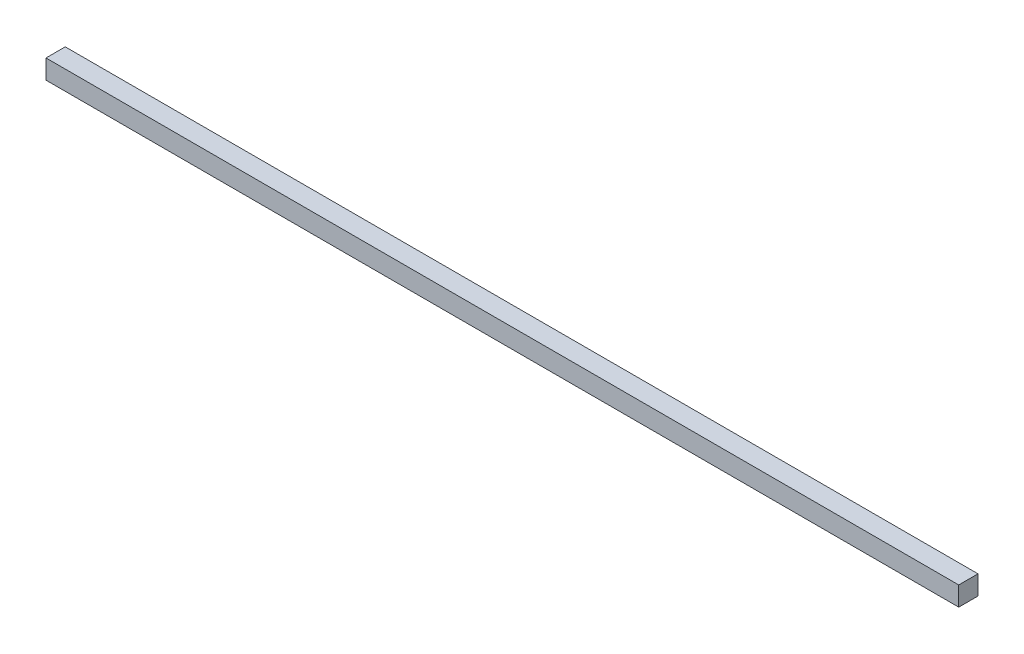
ISO-10303-21;
HEADER;
FILE_DESCRIPTION(('STEP AP214'),'2;1');
FILE_NAME('part.step','',(''),(''),'','','');
FILE_SCHEMA(('AUTOMOTIVE_DESIGN { 1 0 10303 214 1 1 1 1 }'));
ENDSEC;
DATA;
#1=APPLICATION_CONTEXT('core data for automotive mechanical design processes');
#2=APPLICATION_PROTOCOL_DEFINITION('international standard','automotive_design',2000,#1);
#3=PRODUCT_CONTEXT('',#1,'mechanical');
#4=PRODUCT('Part','Part','',(#3));
#5=PRODUCT_RELATED_PRODUCT_CATEGORY('part','',(#4));
#6=PRODUCT_DEFINITION_FORMATION('','',#4);
#7=PRODUCT_DEFINITION_CONTEXT('part definition',#1,'design');
#8=PRODUCT_DEFINITION('design','',#6,#7);
#9=PRODUCT_DEFINITION_SHAPE('','',#8);
#10=(LENGTH_UNIT() NAMED_UNIT(*) SI_UNIT(.MILLI.,.METRE.));
#11=(NAMED_UNIT(*) PLANE_ANGLE_UNIT() SI_UNIT($,.RADIAN.));
#12=(NAMED_UNIT(*) SI_UNIT($,.STERADIAN.) SOLID_ANGLE_UNIT());
#13=UNCERTAINTY_MEASURE_WITH_UNIT(LENGTH_MEASURE(1.E-05),#10,'distance_accuracy_value','');
#14=(GEOMETRIC_REPRESENTATION_CONTEXT(3) GLOBAL_UNCERTAINTY_ASSIGNED_CONTEXT((#13)) GLOBAL_UNIT_ASSIGNED_CONTEXT((#10,
#11,#12)) REPRESENTATION_CONTEXT('',''));
#15=CARTESIAN_POINT('',(0.,0.,0.));
#16=DIRECTION('',(0.,0.,1.));
#17=DIRECTION('',(1.,0.,0.));
#18=AXIS2_PLACEMENT_3D('',#15,#16,#17);
#19=CARTESIAN_POINT('',(150.495,3.175,-3.175));
#20=DIRECTION('',(0.,0.,1.));
#21=DIRECTION('',(0.,-1.,0.));
#22=AXIS2_PLACEMENT_3D('',#19,#20,#21);
#23=PLANE('',#22);
#24=DIRECTION('',(0.,1.,0.));
#25=VECTOR('',#24,1.);
#26=CARTESIAN_POINT('',(-150.495,3.175,-3.175));
#27=LINE('',#26,#25);
#28=CARTESIAN_POINT('',(-150.495,-3.175,-3.175));
#29=VERTEX_POINT('',#28);
#30=CARTESIAN_POINT('',(-150.495,3.175,-3.175));
#31=VERTEX_POINT('',#30);
#32=EDGE_CURVE('E131',#29,#31,#27,.T.);
#33=ORIENTED_EDGE('',*,*,#32,.T.);
#34=DIRECTION('',(-1.,0.,0.));
#35=VECTOR('',#34,1.);
#36=CARTESIAN_POINT('',(150.495,3.175,-3.175));
#37=LINE('',#36,#35);
#38=CARTESIAN_POINT('',(150.495,3.175,-3.175));
#39=VERTEX_POINT('',#38);
#40=EDGE_CURVE('E11',#39,#31,#37,.T.);
#41=ORIENTED_EDGE('',*,*,#40,.F.);
#42=DIRECTION('',(0.,1.,0.));
#43=VECTOR('',#42,1.);
#44=CARTESIAN_POINT('',(150.495,3.175,-3.175));
#45=LINE('',#44,#43);
#46=CARTESIAN_POINT('',(150.495,-3.175,-3.175));
#47=VERTEX_POINT('',#46);
#48=EDGE_CURVE('E115',#47,#39,#45,.T.);
#49=ORIENTED_EDGE('',*,*,#48,.F.);
#50=DIRECTION('',(-1.,0.,0.));
#51=VECTOR('',#50,1.);
#52=CARTESIAN_POINT('',(150.495,-3.175,-3.175));
#53=LINE('',#52,#51);
#54=EDGE_CURVE('E127',#47,#29,#53,.T.);
#55=ORIENTED_EDGE('',*,*,#54,.T.);
#56=EDGE_LOOP('',(#33,#41,#49,#55));
#57=FACE_BOUND('',#56,.T.);
#58=ADVANCED_FACE('F55',(#57),#23,.F.);
#59=CARTESIAN_POINT('',(150.495,3.175,3.175));
#60=DIRECTION('',(0.,-1.,0.));
#61=DIRECTION('',(0.,0.,-1.));
#62=AXIS2_PLACEMENT_3D('',#59,#60,#61);
#63=PLANE('',#62);
#64=DIRECTION('',(0.,0.,1.));
#65=VECTOR('',#64,1.);
#66=CARTESIAN_POINT('',(-150.495,3.175,3.175));
#67=LINE('',#66,#65);
#68=CARTESIAN_POINT('',(-150.495,3.175,3.175));
#69=VERTEX_POINT('',#68);
#70=EDGE_CURVE('E120',#31,#69,#67,.T.);
#71=ORIENTED_EDGE('',*,*,#70,.T.);
#72=DIRECTION('',(-1.,0.,0.));
#73=VECTOR('',#72,1.);
#74=CARTESIAN_POINT('',(150.495,3.175,3.175));
#75=LINE('',#74,#73);
#76=CARTESIAN_POINT('',(150.495,3.175,3.175));
#77=VERTEX_POINT('',#76);
#78=EDGE_CURVE('E64',#77,#69,#75,.T.);
#79=ORIENTED_EDGE('',*,*,#78,.F.);
#80=DIRECTION('',(0.,0.,1.));
#81=VECTOR('',#80,1.);
#82=CARTESIAN_POINT('',(150.495,3.175,3.175));
#83=LINE('',#82,#81);
#84=EDGE_CURVE('E109',#39,#77,#83,.T.);
#85=ORIENTED_EDGE('',*,*,#84,.F.);
#86=ORIENTED_EDGE('',*,*,#40,.T.);
#87=EDGE_LOOP('',(#71,#79,#85,#86));
#88=FACE_BOUND('',#87,.T.);
#89=ADVANCED_FACE('F119',(#88),#63,.F.);
#90=CARTESIAN_POINT('',(150.495,3.175,3.175));
#91=DIRECTION('',(0.,0.,-1.));
#92=DIRECTION('',(0.,1.,0.));
#93=AXIS2_PLACEMENT_3D('',#90,#91,#92);
#94=PLANE('',#93);
#95=DIRECTION('',(0.,-1.,0.));
#96=VECTOR('',#95,1.);
#97=CARTESIAN_POINT('',(-150.495,3.175,3.175));
#98=LINE('',#97,#96);
#99=CARTESIAN_POINT('',(-150.495,-3.175,3.175));
#100=VERTEX_POINT('',#99);
#101=EDGE_CURVE('E95',#69,#100,#98,.T.);
#102=ORIENTED_EDGE('',*,*,#101,.T.);
#103=DIRECTION('',(-1.,0.,0.));
#104=VECTOR('',#103,1.);
#105=CARTESIAN_POINT('',(150.495,-3.175,3.175));
#106=LINE('',#105,#104);
#107=CARTESIAN_POINT('',(150.495,-3.175,3.175));
#108=VERTEX_POINT('',#107);
#109=EDGE_CURVE('E122',#108,#100,#106,.T.);
#110=ORIENTED_EDGE('',*,*,#109,.F.);
#111=DIRECTION('',(0.,-1.,0.));
#112=VECTOR('',#111,1.);
#113=CARTESIAN_POINT('',(150.495,3.175,3.175));
#114=LINE('',#113,#112);
#115=EDGE_CURVE('E113',#77,#108,#114,.T.);
#116=ORIENTED_EDGE('',*,*,#115,.F.);
#117=ORIENTED_EDGE('',*,*,#78,.T.);
#118=EDGE_LOOP('',(#102,#110,#116,#117));
#119=FACE_BOUND('',#118,.T.);
#120=ADVANCED_FACE('F123',(#119),#94,.F.);
#121=CARTESIAN_POINT('',(150.495,-3.175,3.175));
#122=DIRECTION('',(0.,1.,0.));
#123=DIRECTION('',(0.,0.,1.));
#124=AXIS2_PLACEMENT_3D('',#121,#122,#123);
#125=PLANE('',#124);
#126=DIRECTION('',(0.,0.,-1.));
#127=VECTOR('',#126,1.);
#128=CARTESIAN_POINT('',(-150.495,-3.175,3.175));
#129=LINE('',#128,#127);
#130=EDGE_CURVE('E102',#100,#29,#129,.T.);
#131=ORIENTED_EDGE('',*,*,#130,.T.);
#132=ORIENTED_EDGE('',*,*,#54,.F.);
#133=DIRECTION('',(0.,0.,-1.));
#134=VECTOR('',#133,1.);
#135=CARTESIAN_POINT('',(150.495,-3.175,3.175));
#136=LINE('',#135,#134);
#137=EDGE_CURVE('E75',#108,#47,#136,.T.);
#138=ORIENTED_EDGE('',*,*,#137,.F.);
#139=ORIENTED_EDGE('',*,*,#109,.T.);
#140=EDGE_LOOP('',(#131,#132,#138,#139));
#141=FACE_BOUND('',#140,.T.);
#142=ADVANCED_FACE('F144',(#141),#125,.F.);
#143=CARTESIAN_POINT('',(150.495,0.,0.));
#144=DIRECTION('',(1.,0.,0.));
#145=DIRECTION('',(0.,0.,-1.));
#146=AXIS2_PLACEMENT_3D('',#143,#144,#145);
#147=PLANE('',#146);
#148=ORIENTED_EDGE('',*,*,#48,.T.);
#149=ORIENTED_EDGE('',*,*,#84,.T.);
#150=ORIENTED_EDGE('',*,*,#115,.T.);
#151=ORIENTED_EDGE('',*,*,#137,.T.);
#152=EDGE_LOOP('',(#148,#149,#150,#151));
#153=FACE_BOUND('',#152,.T.);
#154=ADVANCED_FACE('F111',(#153),#147,.T.);
#155=CARTESIAN_POINT('',(-150.495,0.,0.));
#156=DIRECTION('',(1.,0.,0.));
#157=DIRECTION('',(0.,0.,-1.));
#158=AXIS2_PLACEMENT_3D('',#155,#156,#157);
#159=PLANE('',#158);
#160=ORIENTED_EDGE('',*,*,#32,.F.);
#161=ORIENTED_EDGE('',*,*,#130,.F.);
#162=ORIENTED_EDGE('',*,*,#101,.F.);
#163=ORIENTED_EDGE('',*,*,#70,.F.);
#164=EDGE_LOOP('',(#160,#161,#162,#163));
#165=FACE_BOUND('',#164,.T.);
#166=ADVANCED_FACE('F147',(#165),#159,.F.);
#167=CLOSED_SHELL('',(#58,#89,#120,#142,#154,#166));
#168=MANIFOLD_SOLID_BREP('B2',#167);
#169=ADVANCED_BREP_SHAPE_REPRESENTATION('',(#18,#168),#14);
#170=SHAPE_DEFINITION_REPRESENTATION(#9,#169);
ENDSEC;
END-ISO-10303-21;
